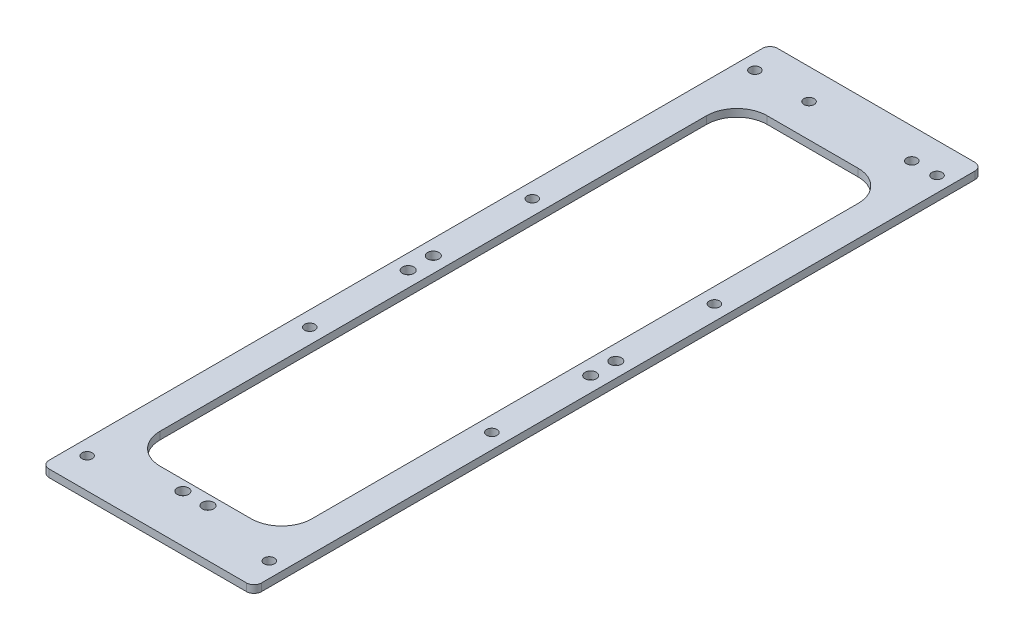
ISO-10303-21;
HEADER;
FILE_DESCRIPTION(('STEP AP214'),'2;1');
FILE_NAME('part.step','',(''),(''),'','','');
FILE_SCHEMA(('AUTOMOTIVE_DESIGN { 1 0 10303 214 1 1 1 1 }'));
ENDSEC;
DATA;
#1=APPLICATION_CONTEXT('core data for automotive mechanical design processes');
#2=APPLICATION_PROTOCOL_DEFINITION('international standard','automotive_design',2000,#1);
#3=PRODUCT_CONTEXT('',#1,'mechanical');
#4=PRODUCT('Part','Part','',(#3));
#5=PRODUCT_RELATED_PRODUCT_CATEGORY('part','',(#4));
#6=PRODUCT_DEFINITION_FORMATION('','',#4);
#7=PRODUCT_DEFINITION_CONTEXT('part definition',#1,'design');
#8=PRODUCT_DEFINITION('design','',#6,#7);
#9=PRODUCT_DEFINITION_SHAPE('','',#8);
#10=(LENGTH_UNIT() NAMED_UNIT(*) SI_UNIT(.MILLI.,.METRE.));
#11=(NAMED_UNIT(*) PLANE_ANGLE_UNIT() SI_UNIT($,.RADIAN.));
#12=(NAMED_UNIT(*) SI_UNIT($,.STERADIAN.) SOLID_ANGLE_UNIT());
#13=UNCERTAINTY_MEASURE_WITH_UNIT(LENGTH_MEASURE(1.E-05),#10,'distance_accuracy_value','');
#14=(GEOMETRIC_REPRESENTATION_CONTEXT(3) GLOBAL_UNCERTAINTY_ASSIGNED_CONTEXT((#13)) GLOBAL_UNIT_ASSIGNED_CONTEXT((#10,
#11,#12)) REPRESENTATION_CONTEXT('',''));
#15=CARTESIAN_POINT('',(0.,0.,0.));
#16=DIRECTION('',(0.,0.,1.));
#17=DIRECTION('',(1.,0.,0.));
#18=AXIS2_PLACEMENT_3D('',#15,#16,#17);
#19=CARTESIAN_POINT('',(0.,3.175,0.));
#20=DIRECTION('',(0.,1.,0.));
#21=DIRECTION('',(0.,0.,1.));
#22=AXIS2_PLACEMENT_3D('',#19,#20,#21);
#23=PLANE('',#22);
#24=CARTESIAN_POINT('',(38.1811171147674,3.175,-5.24625));
#25=DIRECTION('',(0.,1.,0.));
#26=DIRECTION('',(0.,0.,-1.));
#27=AXIS2_PLACEMENT_3D('',#24,#25,#26);
#28=CIRCLE('',#27,2.38125);
#29=CARTESIAN_POINT('',(38.1811171147674,3.175,-7.62749999999999));
#30=VERTEX_POINT('',#29);
#31=EDGE_CURVE('E360',#30,#30,#28,.T.);
#32=ORIENTED_EDGE('',*,*,#31,.F.);
#33=EDGE_LOOP('',(#32));
#34=FACE_BOUND('',#33,.T.);
#35=CARTESIAN_POINT('',(38.1811171147674,3.175,5.24625));
#36=DIRECTION('',(0.,1.,0.));
#37=DIRECTION('',(0.,0.,1.));
#38=AXIS2_PLACEMENT_3D('',#35,#36,#37);
#39=CIRCLE('',#38,2.38125);
#40=CARTESIAN_POINT('',(38.1811171147674,3.175,7.6275));
#41=VERTEX_POINT('',#40);
#42=EDGE_CURVE('E366',#41,#41,#39,.T.);
#43=ORIENTED_EDGE('',*,*,#42,.F.);
#44=EDGE_LOOP('',(#43));
#45=FACE_BOUND('',#44,.T.);
#46=CARTESIAN_POINT('',(-38.1811171147674,3.175,5.24625));
#47=DIRECTION('',(0.,1.,0.));
#48=DIRECTION('',(0.,0.,-1.));
#49=AXIS2_PLACEMENT_3D('',#46,#47,#48);
#50=CIRCLE('',#49,2.38125);
#51=CARTESIAN_POINT('',(-38.1811171147674,3.175,2.86500000000001));
#52=VERTEX_POINT('',#51);
#53=EDGE_CURVE('E372',#52,#52,#50,.T.);
#54=ORIENTED_EDGE('',*,*,#53,.F.);
#55=EDGE_LOOP('',(#54));
#56=FACE_BOUND('',#55,.T.);
#57=CARTESIAN_POINT('',(-38.1811171147674,3.175,-5.24625));
#58=DIRECTION('',(0.,1.,0.));
#59=DIRECTION('',(0.,0.,1.));
#60=AXIS2_PLACEMENT_3D('',#57,#58,#59);
#61=CIRCLE('',#60,2.38125);
#62=CARTESIAN_POINT('',(-38.1811171147674,3.175,-2.865));
#63=VERTEX_POINT('',#62);
#64=EDGE_CURVE('E354',#63,#63,#61,.T.);
#65=ORIENTED_EDGE('',*,*,#64,.F.);
#66=EDGE_LOOP('',(#65));
#67=FACE_BOUND('',#66,.T.);
#68=CARTESIAN_POINT('',(-5.24624998499998,3.175,132.45823257716));
#69=DIRECTION('',(0.,1.,0.));
#70=DIRECTION('',(0.,0.,1.));
#71=AXIS2_PLACEMENT_3D('',#68,#69,#70);
#72=CIRCLE('',#71,2.38125);
#73=CARTESIAN_POINT('',(-5.24624998499998,3.175,134.83948257716));
#74=VERTEX_POINT('',#73);
#75=EDGE_CURVE('E349',#74,#74,#72,.T.);
#76=ORIENTED_EDGE('',*,*,#75,.F.);
#77=EDGE_LOOP('',(#76));
#78=FACE_BOUND('',#77,.T.);
#79=CARTESIAN_POINT('',(5.24624998500002,3.175,132.45823257716));
#80=DIRECTION('',(0.,1.,0.));
#81=DIRECTION('',(0.,0.,-1.));
#82=AXIS2_PLACEMENT_3D('',#79,#80,#81);
#83=CIRCLE('',#82,2.38125);
#84=CARTESIAN_POINT('',(5.24624998500002,3.175,130.07698257716));
#85=VERTEX_POINT('',#84);
#86=EDGE_CURVE('E342',#85,#85,#83,.T.);
#87=ORIENTED_EDGE('',*,*,#86,.F.);
#88=EDGE_LOOP('',(#87));
#89=FACE_BOUND('',#88,.T.);
#90=CARTESIAN_POINT('',(-15.4178,3.175,-139.7));
#91=DIRECTION('',(0.,1.,0.));
#92=DIRECTION('',(0.,0.,1.));
#93=AXIS2_PLACEMENT_3D('',#90,#91,#92);
#94=CIRCLE('',#93,2.15899999999999);
#95=CARTESIAN_POINT('',(-15.4178,3.175,-137.541));
#96=VERTEX_POINT('',#95);
#97=EDGE_CURVE('E337',#96,#96,#94,.T.);
#98=ORIENTED_EDGE('',*,*,#97,.F.);
#99=EDGE_LOOP('',(#98));
#100=FACE_BOUND('',#99,.T.);
#101=CARTESIAN_POINT('',(27.5844,3.175,-139.7));
#102=DIRECTION('',(0.,1.,0.));
#103=DIRECTION('',(0.,0.,1.));
#104=AXIS2_PLACEMENT_3D('',#101,#102,#103);
#105=CIRCLE('',#104,2.15899999999999);
#106=CARTESIAN_POINT('',(27.5844,3.175,-137.541));
#107=VERTEX_POINT('',#106);
#108=EDGE_CURVE('E333',#107,#107,#105,.T.);
#109=ORIENTED_EDGE('',*,*,#108,.F.);
#110=EDGE_LOOP('',(#109));
#111=FACE_BOUND('',#110,.T.);
#112=CARTESIAN_POINT('',(38.1,3.175,-46.6021183814132));
#113=DIRECTION('',(0.,1.,0.));
#114=DIRECTION('',(0.,0.,-1.));
#115=AXIS2_PLACEMENT_3D('',#112,#113,#114);
#116=CIRCLE('',#115,2.15899999999998);
#117=CARTESIAN_POINT('',(38.1,3.175,-48.7611183814132));
#118=VERTEX_POINT('',#117);
#119=EDGE_CURVE('E300',#118,#118,#116,.T.);
#120=ORIENTED_EDGE('',*,*,#119,.F.);
#121=EDGE_LOOP('',(#120));
#122=FACE_BOUND('',#121,.T.);
#123=CARTESIAN_POINT('',(-38.1,3.175,139.663955618587));
#124=DIRECTION('',(0.,1.,0.));
#125=DIRECTION('',(0.,0.,1.));
#126=AXIS2_PLACEMENT_3D('',#123,#124,#125);
#127=CIRCLE('',#126,2.15899999999998);
#128=CARTESIAN_POINT('',(-38.1,3.175,141.822955618587));
#129=VERTEX_POINT('',#128);
#130=EDGE_CURVE('E307',#129,#129,#127,.T.);
#131=ORIENTED_EDGE('',*,*,#130,.F.);
#132=EDGE_LOOP('',(#131));
#133=FACE_BOUND('',#132,.T.);
#134=CARTESIAN_POINT('',(-38.1,3.175,46.5305376185868));
#135=DIRECTION('',(0.,1.,0.));
#136=DIRECTION('',(0.,0.,1.));
#137=AXIS2_PLACEMENT_3D('',#134,#135,#136);
#138=CIRCLE('',#137,2.15899999999998);
#139=CARTESIAN_POINT('',(-38.1,3.175,48.6895376185868));
#140=VERTEX_POINT('',#139);
#141=EDGE_CURVE('E288',#140,#140,#138,.T.);
#142=ORIENTED_EDGE('',*,*,#141,.F.);
#143=EDGE_LOOP('',(#142));
#144=FACE_BOUND('',#143,.T.);
#145=CARTESIAN_POINT('',(-38.1,3.175,-46.6028803814132));
#146=DIRECTION('',(0.,1.,0.));
#147=DIRECTION('',(0.,0.,1.));
#148=AXIS2_PLACEMENT_3D('',#145,#146,#147);
#149=CIRCLE('',#148,2.15899999999998);
#150=CARTESIAN_POINT('',(-38.1,3.175,-44.4438803814132));
#151=VERTEX_POINT('',#150);
#152=EDGE_CURVE('E295',#151,#151,#149,.T.);
#153=ORIENTED_EDGE('',*,*,#152,.F.);
#154=EDGE_LOOP('',(#153));
#155=FACE_BOUND('',#154,.T.);
#156=CARTESIAN_POINT('',(38.1,3.175,46.5320616185868));
#157=DIRECTION('',(0.,1.,0.));
#158=DIRECTION('',(0.,0.,-1.));
#159=AXIS2_PLACEMENT_3D('',#156,#157,#158);
#160=CIRCLE('',#159,2.15899999999998);
#161=CARTESIAN_POINT('',(38.1,3.175,44.3730616185868));
#162=VERTEX_POINT('',#161);
#163=EDGE_CURVE('E325',#162,#162,#160,.T.);
#164=ORIENTED_EDGE('',*,*,#163,.F.);
#165=EDGE_LOOP('',(#164));
#166=FACE_BOUND('',#165,.T.);
#167=CARTESIAN_POINT('',(38.1,3.175,139.666241618587));
#168=DIRECTION('',(0.,1.,0.));
#169=DIRECTION('',(0.,0.,-1.));
#170=AXIS2_PLACEMENT_3D('',#167,#168,#169);
#171=CIRCLE('',#170,2.15899999999998);
#172=CARTESIAN_POINT('',(38.1,3.175,137.507241618587));
#173=VERTEX_POINT('',#172);
#174=EDGE_CURVE('E319',#173,#173,#171,.T.);
#175=ORIENTED_EDGE('',*,*,#174,.F.);
#176=EDGE_LOOP('',(#175));
#177=FACE_BOUND('',#176,.T.);
#178=CARTESIAN_POINT('',(38.1,3.175,-139.736298381413));
#179=DIRECTION('',(0.,1.,0.));
#180=DIRECTION('',(0.,0.,-1.));
#181=AXIS2_PLACEMENT_3D('',#178,#179,#180);
#182=CIRCLE('',#181,2.15899999999998);
#183=CARTESIAN_POINT('',(38.1,3.175,-141.895298381413));
#184=VERTEX_POINT('',#183);
#185=EDGE_CURVE('E312',#184,#184,#182,.T.);
#186=ORIENTED_EDGE('',*,*,#185,.F.);
#187=EDGE_LOOP('',(#186));
#188=FACE_BOUND('',#187,.T.);
#189=CARTESIAN_POINT('',(-38.1,3.175,-139.736298381413));
#190=DIRECTION('',(0.,1.,0.));
#191=DIRECTION('',(0.,0.,1.));
#192=AXIS2_PLACEMENT_3D('',#189,#190,#191);
#193=CIRCLE('',#192,2.15899999999998);
#194=CARTESIAN_POINT('',(-38.1,3.175,-137.577298381413));
#195=VERTEX_POINT('',#194);
#196=EDGE_CURVE('E282',#195,#195,#193,.T.);
#197=ORIENTED_EDGE('',*,*,#196,.F.);
#198=EDGE_LOOP('',(#197));
#199=FACE_BOUND('',#198,.T.);
#200=DIRECTION('',(0.,0.,1.));
#201=VECTOR('',#200,1.);
#202=CARTESIAN_POINT('',(-44.45,3.175,-152.4));
#203=LINE('',#202,#201);
#204=CARTESIAN_POINT('',(-44.45,3.175,-149.225));
#205=VERTEX_POINT('',#204);
#206=CARTESIAN_POINT('',(-44.45,3.175,149.225));
#207=VERTEX_POINT('',#206);
#208=EDGE_CURVE('E253',#205,#207,#203,.T.);
#209=ORIENTED_EDGE('',*,*,#208,.T.);
#210=CARTESIAN_POINT('',(-41.275,3.175,149.225));
#211=DIRECTION('',(0.,1.,0.));
#212=DIRECTION('',(0.,0.,1.));
#213=AXIS2_PLACEMENT_3D('',#210,#211,#212);
#214=CIRCLE('',#213,3.175);
#215=CARTESIAN_POINT('',(-41.275,3.175,152.4));
#216=VERTEX_POINT('',#215);
#217=EDGE_CURVE('E232',#207,#216,#214,.T.);
#218=ORIENTED_EDGE('',*,*,#217,.T.);
#219=DIRECTION('',(1.,0.,0.));
#220=VECTOR('',#219,1.);
#221=CARTESIAN_POINT('',(-44.45,3.175,152.4));
#222=LINE('',#221,#220);
#223=CARTESIAN_POINT('',(41.275,3.175,152.4));
#224=VERTEX_POINT('',#223);
#225=EDGE_CURVE('E261',#216,#224,#222,.T.);
#226=ORIENTED_EDGE('',*,*,#225,.T.);
#227=CARTESIAN_POINT('',(41.275,3.175,149.225));
#228=DIRECTION('',(0.,1.,0.));
#229=DIRECTION('',(0.,0.,1.));
#230=AXIS2_PLACEMENT_3D('',#227,#228,#229);
#231=CIRCLE('',#230,3.175);
#232=CARTESIAN_POINT('',(44.45,3.175,149.225));
#233=VERTEX_POINT('',#232);
#234=EDGE_CURVE('E230',#224,#233,#231,.T.);
#235=ORIENTED_EDGE('',*,*,#234,.T.);
#236=DIRECTION('',(0.,0.,-1.));
#237=VECTOR('',#236,1.);
#238=CARTESIAN_POINT('',(44.45,3.175,-152.4));
#239=LINE('',#238,#237);
#240=CARTESIAN_POINT('',(44.45,3.175,-149.225));
#241=VERTEX_POINT('',#240);
#242=EDGE_CURVE('E178',#233,#241,#239,.T.);
#243=ORIENTED_EDGE('',*,*,#242,.T.);
#244=CARTESIAN_POINT('',(41.275,3.175,-149.225));
#245=DIRECTION('',(0.,1.,0.));
#246=DIRECTION('',(0.,0.,1.));
#247=AXIS2_PLACEMENT_3D('',#244,#245,#246);
#248=CIRCLE('',#247,3.175);
#249=CARTESIAN_POINT('',(41.275,3.175,-152.4));
#250=VERTEX_POINT('',#249);
#251=EDGE_CURVE('E55',#241,#250,#248,.T.);
#252=ORIENTED_EDGE('',*,*,#251,.T.);
#253=DIRECTION('',(-1.,0.,0.));
#254=VECTOR('',#253,1.);
#255=CARTESIAN_POINT('',(-44.45,3.175,-152.4));
#256=LINE('',#255,#254);
#257=CARTESIAN_POINT('',(-41.275,3.175,-152.4));
#258=VERTEX_POINT('',#257);
#259=EDGE_CURVE('E174',#250,#258,#256,.T.);
#260=ORIENTED_EDGE('',*,*,#259,.T.);
#261=CARTESIAN_POINT('',(-41.275,3.175,-149.225));
#262=DIRECTION('',(0.,1.,0.));
#263=DIRECTION('',(0.,0.,1.));
#264=AXIS2_PLACEMENT_3D('',#261,#262,#263);
#265=CIRCLE('',#264,3.175);
#266=EDGE_CURVE('E227',#258,#205,#265,.T.);
#267=ORIENTED_EDGE('',*,*,#266,.T.);
#268=EDGE_LOOP('',(#209,#218,#226,#235,#243,#252,#260,#267));
#269=FACE_BOUND('',#268,.T.);
#270=DIRECTION('',(1.,0.,0.));
#271=VECTOR('',#270,1.);
#272=CARTESIAN_POINT('',(-31.75,3.175,128.17693257716));
#273=LINE('',#272,#271);
#274=CARTESIAN_POINT('',(-19.05,3.175,128.17693257716));
#275=VERTEX_POINT('',#274);
#276=CARTESIAN_POINT('',(19.05,3.175,128.17693257716));
#277=VERTEX_POINT('',#276);
#278=EDGE_CURVE('E278',#275,#277,#273,.T.);
#279=ORIENTED_EDGE('',*,*,#278,.F.);
#280=CARTESIAN_POINT('',(-19.05,3.175,115.47693257716));
#281=DIRECTION('',(0.,1.,0.));
#282=DIRECTION('',(0.,0.,1.));
#283=AXIS2_PLACEMENT_3D('',#280,#281,#282);
#284=CIRCLE('',#283,12.7);
#285=CARTESIAN_POINT('',(-31.75,3.175,115.47693257716));
#286=VERTEX_POINT('',#285);
#287=EDGE_CURVE('E159',#275,#286,#284,.F.);
#288=ORIENTED_EDGE('',*,*,#287,.T.);
#289=DIRECTION('',(0.,0.,1.));
#290=VECTOR('',#289,1.);
#291=CARTESIAN_POINT('',(-31.75,3.175,-125.82306742284));
#292=LINE('',#291,#290);
#293=CARTESIAN_POINT('',(-31.75,3.175,-113.12306742284));
#294=VERTEX_POINT('',#293);
#295=EDGE_CURVE('E268',#294,#286,#292,.T.);
#296=ORIENTED_EDGE('',*,*,#295,.F.);
#297=CARTESIAN_POINT('',(-19.05,3.175,-113.12306742284));
#298=DIRECTION('',(0.,1.,0.));
#299=DIRECTION('',(0.,0.,1.));
#300=AXIS2_PLACEMENT_3D('',#297,#298,#299);
#301=CIRCLE('',#300,12.7);
#302=CARTESIAN_POINT('',(-19.05,3.175,-125.82306742284));
#303=VERTEX_POINT('',#302);
#304=EDGE_CURVE('E203',#294,#303,#301,.F.);
#305=ORIENTED_EDGE('',*,*,#304,.T.);
#306=DIRECTION('',(-1.,0.,0.));
#307=VECTOR('',#306,1.);
#308=CARTESIAN_POINT('',(-31.75,3.175,-125.82306742284));
#309=LINE('',#308,#307);
#310=CARTESIAN_POINT('',(19.05,3.175,-125.82306742284));
#311=VERTEX_POINT('',#310);
#312=EDGE_CURVE('E258',#311,#303,#309,.T.);
#313=ORIENTED_EDGE('',*,*,#312,.F.);
#314=CARTESIAN_POINT('',(19.0500000000001,3.175,-113.12306742284));
#315=DIRECTION('',(0.,1.,0.));
#316=DIRECTION('',(0.,0.,1.));
#317=AXIS2_PLACEMENT_3D('',#314,#315,#316);
#318=CIRCLE('',#317,12.7);
#319=CARTESIAN_POINT('',(31.75,3.175,-113.12306742284));
#320=VERTEX_POINT('',#319);
#321=EDGE_CURVE('E207',#311,#320,#318,.F.);
#322=ORIENTED_EDGE('',*,*,#321,.T.);
#323=DIRECTION('',(0.,0.,-1.));
#324=VECTOR('',#323,1.);
#325=CARTESIAN_POINT('',(31.75,3.175,-125.82306742284));
#326=LINE('',#325,#324);
#327=CARTESIAN_POINT('',(31.75,3.175,115.47693257716));
#328=VERTEX_POINT('',#327);
#329=EDGE_CURVE('E275',#328,#320,#326,.T.);
#330=ORIENTED_EDGE('',*,*,#329,.F.);
#331=CARTESIAN_POINT('',(19.05,3.175,115.47693257716));
#332=DIRECTION('',(0.,1.,0.));
#333=DIRECTION('',(0.,0.,1.));
#334=AXIS2_PLACEMENT_3D('',#331,#332,#333);
#335=CIRCLE('',#334,12.7);
#336=EDGE_CURVE('E160',#328,#277,#335,.F.);
#337=ORIENTED_EDGE('',*,*,#336,.T.);
#338=EDGE_LOOP('',(#279,#288,#296,#305,#313,#322,#330,#337));
#339=FACE_BOUND('',#338,.T.);
#340=ADVANCED_FACE('F34',(#34,#45,#56,#67,#78,#89,#100,#111,#122,#133,#144,#155,#166,#177,#188,
#199,#269,#339),#23,.T.);
#341=CARTESIAN_POINT('',(0.,0.,0.));
#342=DIRECTION('',(0.,1.,0.));
#343=DIRECTION('',(0.,0.,1.));
#344=AXIS2_PLACEMENT_3D('',#341,#342,#343);
#345=PLANE('',#344);
#346=CARTESIAN_POINT('',(38.1811171147674,0.,-5.24625));
#347=DIRECTION('',(0.,1.,0.));
#348=DIRECTION('',(0.,0.,-1.));
#349=AXIS2_PLACEMENT_3D('',#346,#347,#348);
#350=CIRCLE('',#349,2.38125);
#351=CARTESIAN_POINT('',(38.1811171147674,0.,-7.62749999999999));
#352=VERTEX_POINT('',#351);
#353=EDGE_CURVE('E363',#352,#352,#350,.T.);
#354=ORIENTED_EDGE('',*,*,#353,.T.);
#355=EDGE_LOOP('',(#354));
#356=FACE_BOUND('',#355,.T.);
#357=CARTESIAN_POINT('',(38.1811171147674,0.,5.24625));
#358=DIRECTION('',(0.,1.,0.));
#359=DIRECTION('',(0.,0.,1.));
#360=AXIS2_PLACEMENT_3D('',#357,#358,#359);
#361=CIRCLE('',#360,2.38125);
#362=CARTESIAN_POINT('',(38.1811171147674,0.,7.6275));
#363=VERTEX_POINT('',#362);
#364=EDGE_CURVE('E369',#363,#363,#361,.T.);
#365=ORIENTED_EDGE('',*,*,#364,.T.);
#366=EDGE_LOOP('',(#365));
#367=FACE_BOUND('',#366,.T.);
#368=CARTESIAN_POINT('',(-38.1811171147674,0.,5.24625));
#369=DIRECTION('',(0.,1.,0.));
#370=DIRECTION('',(0.,0.,-1.));
#371=AXIS2_PLACEMENT_3D('',#368,#369,#370);
#372=CIRCLE('',#371,2.38125);
#373=CARTESIAN_POINT('',(-38.1811171147674,0.,2.86500000000001));
#374=VERTEX_POINT('',#373);
#375=EDGE_CURVE('E357',#374,#374,#372,.T.);
#376=ORIENTED_EDGE('',*,*,#375,.T.);
#377=EDGE_LOOP('',(#376));
#378=FACE_BOUND('',#377,.T.);
#379=CARTESIAN_POINT('',(-38.1811171147674,0.,-5.24625));
#380=DIRECTION('',(0.,1.,0.));
#381=DIRECTION('',(0.,0.,1.));
#382=AXIS2_PLACEMENT_3D('',#379,#380,#381);
#383=CIRCLE('',#382,2.38125);
#384=CARTESIAN_POINT('',(-38.1811171147674,0.,-2.865));
#385=VERTEX_POINT('',#384);
#386=EDGE_CURVE('E346',#385,#385,#383,.T.);
#387=ORIENTED_EDGE('',*,*,#386,.T.);
#388=EDGE_LOOP('',(#387));
#389=FACE_BOUND('',#388,.T.);
#390=CARTESIAN_POINT('',(-5.24624998499998,0.,132.45823257716));
#391=DIRECTION('',(0.,1.,0.));
#392=DIRECTION('',(0.,0.,1.));
#393=AXIS2_PLACEMENT_3D('',#390,#391,#392);
#394=CIRCLE('',#393,2.38125);
#395=CARTESIAN_POINT('',(-5.24624998499998,0.,134.83948257716));
#396=VERTEX_POINT('',#395);
#397=EDGE_CURVE('E334',#396,#396,#394,.T.);
#398=ORIENTED_EDGE('',*,*,#397,.T.);
#399=EDGE_LOOP('',(#398));
#400=FACE_BOUND('',#399,.T.);
#401=CARTESIAN_POINT('',(5.24624998500002,0.,132.45823257716));
#402=DIRECTION('',(0.,1.,0.));
#403=DIRECTION('',(0.,0.,-1.));
#404=AXIS2_PLACEMENT_3D('',#401,#402,#403);
#405=CIRCLE('',#404,2.38125);
#406=CARTESIAN_POINT('',(5.24624998500002,0.,130.07698257716));
#407=VERTEX_POINT('',#406);
#408=EDGE_CURVE('E345',#407,#407,#405,.T.);
#409=ORIENTED_EDGE('',*,*,#408,.T.);
#410=EDGE_LOOP('',(#409));
#411=FACE_BOUND('',#410,.T.);
#412=CARTESIAN_POINT('',(-15.4178,0.,-139.7));
#413=DIRECTION('',(0.,1.,0.));
#414=DIRECTION('',(0.,0.,1.));
#415=AXIS2_PLACEMENT_3D('',#412,#413,#414);
#416=CIRCLE('',#415,2.15899999999999);
#417=CARTESIAN_POINT('',(-15.4178,0.,-137.541));
#418=VERTEX_POINT('',#417);
#419=EDGE_CURVE('E316',#418,#418,#416,.T.);
#420=ORIENTED_EDGE('',*,*,#419,.T.);
#421=EDGE_LOOP('',(#420));
#422=FACE_BOUND('',#421,.T.);
#423=CARTESIAN_POINT('',(27.5844,0.,-139.7));
#424=DIRECTION('',(0.,1.,0.));
#425=DIRECTION('',(0.,0.,1.));
#426=AXIS2_PLACEMENT_3D('',#423,#424,#425);
#427=CIRCLE('',#426,2.15899999999999);
#428=CARTESIAN_POINT('',(27.5844,0.,-137.541));
#429=VERTEX_POINT('',#428);
#430=EDGE_CURVE('E330',#429,#429,#427,.T.);
#431=ORIENTED_EDGE('',*,*,#430,.T.);
#432=EDGE_LOOP('',(#431));
#433=FACE_BOUND('',#432,.T.);
#434=CARTESIAN_POINT('',(38.1,0.,-46.6021183814132));
#435=DIRECTION('',(0.,1.,0.));
#436=DIRECTION('',(0.,0.,-1.));
#437=AXIS2_PLACEMENT_3D('',#434,#435,#436);
#438=CIRCLE('',#437,2.15899999999998);
#439=CARTESIAN_POINT('',(38.1,0.,-48.7611183814132));
#440=VERTEX_POINT('',#439);
#441=EDGE_CURVE('E303',#440,#440,#438,.T.);
#442=ORIENTED_EDGE('',*,*,#441,.T.);
#443=EDGE_LOOP('',(#442));
#444=FACE_BOUND('',#443,.T.);
#445=CARTESIAN_POINT('',(-38.1,0.,139.663955618587));
#446=DIRECTION('',(0.,1.,0.));
#447=DIRECTION('',(0.,0.,1.));
#448=AXIS2_PLACEMENT_3D('',#445,#446,#447);
#449=CIRCLE('',#448,2.15899999999998);
#450=CARTESIAN_POINT('',(-38.1,0.,141.822955618587));
#451=VERTEX_POINT('',#450);
#452=EDGE_CURVE('E292',#451,#451,#449,.T.);
#453=ORIENTED_EDGE('',*,*,#452,.T.);
#454=EDGE_LOOP('',(#453));
#455=FACE_BOUND('',#454,.T.);
#456=CARTESIAN_POINT('',(-38.1,0.,46.5305376185868));
#457=DIRECTION('',(0.,1.,0.));
#458=DIRECTION('',(0.,0.,1.));
#459=AXIS2_PLACEMENT_3D('',#456,#457,#458);
#460=CIRCLE('',#459,2.15899999999998);
#461=CARTESIAN_POINT('',(-38.1,0.,48.6895376185868));
#462=VERTEX_POINT('',#461);
#463=EDGE_CURVE('E291',#462,#462,#460,.T.);
#464=ORIENTED_EDGE('',*,*,#463,.T.);
#465=EDGE_LOOP('',(#464));
#466=FACE_BOUND('',#465,.T.);
#467=CARTESIAN_POINT('',(-38.1,0.,-46.6028803814132));
#468=DIRECTION('',(0.,1.,0.));
#469=DIRECTION('',(0.,0.,1.));
#470=AXIS2_PLACEMENT_3D('',#467,#468,#469);
#471=CIRCLE('',#470,2.15899999999998);
#472=CARTESIAN_POINT('',(-38.1,0.,-44.4438803814132));
#473=VERTEX_POINT('',#472);
#474=EDGE_CURVE('E285',#473,#473,#471,.T.);
#475=ORIENTED_EDGE('',*,*,#474,.T.);
#476=EDGE_LOOP('',(#475));
#477=FACE_BOUND('',#476,.T.);
#478=CARTESIAN_POINT('',(38.1,0.,46.5320616185868));
#479=DIRECTION('',(0.,1.,0.));
#480=DIRECTION('',(0.,0.,-1.));
#481=AXIS2_PLACEMENT_3D('',#478,#479,#480);
#482=CIRCLE('',#481,2.15899999999998);
#483=CARTESIAN_POINT('',(38.1,0.,44.3730616185868));
#484=VERTEX_POINT('',#483);
#485=EDGE_CURVE('E304',#484,#484,#482,.T.);
#486=ORIENTED_EDGE('',*,*,#485,.T.);
#487=EDGE_LOOP('',(#486));
#488=FACE_BOUND('',#487,.T.);
#489=CARTESIAN_POINT('',(38.1,0.,139.666241618587));
#490=DIRECTION('',(0.,1.,0.));
#491=DIRECTION('',(0.,0.,-1.));
#492=AXIS2_PLACEMENT_3D('',#489,#490,#491);
#493=CIRCLE('',#492,2.15899999999998);
#494=CARTESIAN_POINT('',(38.1,0.,137.507241618587));
#495=VERTEX_POINT('',#494);
#496=EDGE_CURVE('E322',#495,#495,#493,.T.);
#497=ORIENTED_EDGE('',*,*,#496,.T.);
#498=EDGE_LOOP('',(#497));
#499=FACE_BOUND('',#498,.T.);
#500=CARTESIAN_POINT('',(38.1,0.,-139.736298381413));
#501=DIRECTION('',(0.,1.,0.));
#502=DIRECTION('',(0.,0.,-1.));
#503=AXIS2_PLACEMENT_3D('',#500,#501,#502);
#504=CIRCLE('',#503,2.15899999999998);
#505=CARTESIAN_POINT('',(38.1,0.,-141.895298381413));
#506=VERTEX_POINT('',#505);
#507=EDGE_CURVE('E315',#506,#506,#504,.T.);
#508=ORIENTED_EDGE('',*,*,#507,.T.);
#509=EDGE_LOOP('',(#508));
#510=FACE_BOUND('',#509,.T.);
#511=CARTESIAN_POINT('',(-38.1,0.,-139.736298381413));
#512=DIRECTION('',(0.,1.,0.));
#513=DIRECTION('',(0.,0.,1.));
#514=AXIS2_PLACEMENT_3D('',#511,#512,#513);
#515=CIRCLE('',#514,2.15899999999998);
#516=CARTESIAN_POINT('',(-38.1,0.,-137.577298381413));
#517=VERTEX_POINT('',#516);
#518=EDGE_CURVE('E272',#517,#517,#515,.T.);
#519=ORIENTED_EDGE('',*,*,#518,.T.);
#520=EDGE_LOOP('',(#519));
#521=FACE_BOUND('',#520,.T.);
#522=DIRECTION('',(1.,0.,0.));
#523=VECTOR('',#522,1.);
#524=CARTESIAN_POINT('',(-44.45,0.,152.4));
#525=LINE('',#524,#523);
#526=CARTESIAN_POINT('',(-41.275,0.,152.4));
#527=VERTEX_POINT('',#526);
#528=CARTESIAN_POINT('',(41.275,0.,152.4));
#529=VERTEX_POINT('',#528);
#530=EDGE_CURVE('E252',#527,#529,#525,.T.);
#531=ORIENTED_EDGE('',*,*,#530,.F.);
#532=CARTESIAN_POINT('',(-41.275,0.,149.225));
#533=DIRECTION('',(0.,1.,0.));
#534=DIRECTION('',(0.,0.,1.));
#535=AXIS2_PLACEMENT_3D('',#532,#533,#534);
#536=CIRCLE('',#535,3.175);
#537=CARTESIAN_POINT('',(-44.45,0.,149.225));
#538=VERTEX_POINT('',#537);
#539=EDGE_CURVE('E220',#527,#538,#536,.F.);
#540=ORIENTED_EDGE('',*,*,#539,.T.);
#541=DIRECTION('',(0.,0.,1.));
#542=VECTOR('',#541,1.);
#543=CARTESIAN_POINT('',(-44.45,0.,-152.4));
#544=LINE('',#543,#542);
#545=CARTESIAN_POINT('',(-44.45,0.,-149.225));
#546=VERTEX_POINT('',#545);
#547=EDGE_CURVE('E254',#546,#538,#544,.T.);
#548=ORIENTED_EDGE('',*,*,#547,.F.);
#549=CARTESIAN_POINT('',(-41.275,0.,-149.225));
#550=DIRECTION('',(0.,1.,0.));
#551=DIRECTION('',(0.,0.,1.));
#552=AXIS2_PLACEMENT_3D('',#549,#550,#551);
#553=CIRCLE('',#552,3.175);
#554=CARTESIAN_POINT('',(-41.275,0.,-152.4));
#555=VERTEX_POINT('',#554);
#556=EDGE_CURVE('E214',#546,#555,#553,.F.);
#557=ORIENTED_EDGE('',*,*,#556,.T.);
#558=DIRECTION('',(-1.,0.,0.));
#559=VECTOR('',#558,1.);
#560=CARTESIAN_POINT('',(-44.45,0.,-152.4));
#561=LINE('',#560,#559);
#562=CARTESIAN_POINT('',(41.275,0.,-152.4));
#563=VERTEX_POINT('',#562);
#564=EDGE_CURVE('E181',#563,#555,#561,.T.);
#565=ORIENTED_EDGE('',*,*,#564,.F.);
#566=CARTESIAN_POINT('',(41.275,0.,-149.225));
#567=DIRECTION('',(0.,1.,0.));
#568=DIRECTION('',(0.,0.,1.));
#569=AXIS2_PLACEMENT_3D('',#566,#567,#568);
#570=CIRCLE('',#569,3.175);
#571=CARTESIAN_POINT('',(44.45,0.,-149.225));
#572=VERTEX_POINT('',#571);
#573=EDGE_CURVE('E216',#563,#572,#570,.F.);
#574=ORIENTED_EDGE('',*,*,#573,.T.);
#575=DIRECTION('',(0.,0.,-1.));
#576=VECTOR('',#575,1.);
#577=CARTESIAN_POINT('',(44.45,0.,-152.4));
#578=LINE('',#577,#576);
#579=CARTESIAN_POINT('',(44.45,0.,149.225));
#580=VERTEX_POINT('',#579);
#581=EDGE_CURVE('E244',#580,#572,#578,.T.);
#582=ORIENTED_EDGE('',*,*,#581,.F.);
#583=CARTESIAN_POINT('',(41.275,0.,149.225));
#584=DIRECTION('',(0.,1.,0.));
#585=DIRECTION('',(0.,0.,1.));
#586=AXIS2_PLACEMENT_3D('',#583,#584,#585);
#587=CIRCLE('',#586,3.175);
#588=EDGE_CURVE('E218',#580,#529,#587,.F.);
#589=ORIENTED_EDGE('',*,*,#588,.T.);
#590=EDGE_LOOP('',(#531,#540,#548,#557,#565,#574,#582,#589));
#591=FACE_BOUND('',#590,.T.);
#592=DIRECTION('',(-1.,0.,0.));
#593=VECTOR('',#592,1.);
#594=CARTESIAN_POINT('',(-31.75,0.,-125.82306742284));
#595=LINE('',#594,#593);
#596=CARTESIAN_POINT('',(19.05,0.,-125.82306742284));
#597=VERTEX_POINT('',#596);
#598=CARTESIAN_POINT('',(-19.05,0.,-125.82306742284));
#599=VERTEX_POINT('',#598);
#600=EDGE_CURVE('E266',#597,#599,#595,.T.);
#601=ORIENTED_EDGE('',*,*,#600,.T.);
#602=CARTESIAN_POINT('',(-19.05,0.,-113.12306742284));
#603=DIRECTION('',(0.,1.,0.));
#604=DIRECTION('',(0.,0.,1.));
#605=AXIS2_PLACEMENT_3D('',#602,#603,#604);
#606=CIRCLE('',#605,12.7);
#607=CARTESIAN_POINT('',(-31.75,0.,-113.12306742284));
#608=VERTEX_POINT('',#607);
#609=EDGE_CURVE('E201',#599,#608,#606,.T.);
#610=ORIENTED_EDGE('',*,*,#609,.T.);
#611=DIRECTION('',(0.,0.,1.));
#612=VECTOR('',#611,1.);
#613=CARTESIAN_POINT('',(-31.75,0.,-125.82306742284));
#614=LINE('',#613,#612);
#615=CARTESIAN_POINT('',(-31.75,0.,115.47693257716));
#616=VERTEX_POINT('',#615);
#617=EDGE_CURVE('E154',#608,#616,#614,.T.);
#618=ORIENTED_EDGE('',*,*,#617,.T.);
#619=CARTESIAN_POINT('',(-19.05,0.,115.47693257716));
#620=DIRECTION('',(0.,1.,0.));
#621=DIRECTION('',(0.,0.,1.));
#622=AXIS2_PLACEMENT_3D('',#619,#620,#621);
#623=CIRCLE('',#622,12.7);
#624=CARTESIAN_POINT('',(-19.05,0.,128.17693257716));
#625=VERTEX_POINT('',#624);
#626=EDGE_CURVE('E148',#616,#625,#623,.T.);
#627=ORIENTED_EDGE('',*,*,#626,.T.);
#628=DIRECTION('',(1.,0.,0.));
#629=VECTOR('',#628,1.);
#630=CARTESIAN_POINT('',(-31.75,0.,128.17693257716));
#631=LINE('',#630,#629);
#632=CARTESIAN_POINT('',(19.05,0.,128.17693257716));
#633=VERTEX_POINT('',#632);
#634=EDGE_CURVE('E152',#625,#633,#631,.T.);
#635=ORIENTED_EDGE('',*,*,#634,.T.);
#636=CARTESIAN_POINT('',(19.05,0.,115.47693257716));
#637=DIRECTION('',(0.,1.,0.));
#638=DIRECTION('',(0.,0.,1.));
#639=AXIS2_PLACEMENT_3D('',#636,#637,#638);
#640=CIRCLE('',#639,12.7);
#641=CARTESIAN_POINT('',(31.75,0.,115.47693257716));
#642=VERTEX_POINT('',#641);
#643=EDGE_CURVE('E197',#633,#642,#640,.T.);
#644=ORIENTED_EDGE('',*,*,#643,.T.);
#645=DIRECTION('',(0.,0.,-1.));
#646=VECTOR('',#645,1.);
#647=CARTESIAN_POINT('',(31.75,0.,-125.82306742284));
#648=LINE('',#647,#646);
#649=CARTESIAN_POINT('',(31.75,0.,-113.12306742284));
#650=VERTEX_POINT('',#649);
#651=EDGE_CURVE('E170',#642,#650,#648,.T.);
#652=ORIENTED_EDGE('',*,*,#651,.T.);
#653=CARTESIAN_POINT('',(19.0500000000001,0.,-113.12306742284));
#654=DIRECTION('',(0.,1.,0.));
#655=DIRECTION('',(0.,0.,1.));
#656=AXIS2_PLACEMENT_3D('',#653,#654,#655);
#657=CIRCLE('',#656,12.7);
#658=EDGE_CURVE('E205',#650,#597,#657,.T.);
#659=ORIENTED_EDGE('',*,*,#658,.T.);
#660=EDGE_LOOP('',(#601,#610,#618,#627,#635,#644,#652,#659));
#661=FACE_BOUND('',#660,.T.);
#662=ADVANCED_FACE('F151',(#356,#367,#378,#389,#400,#411,#422,#433,#444,#455,#466,#477,#488,
#499,#510,#521,#591,#661),#345,.F.);
#663=CARTESIAN_POINT('',(-44.45,3.175,-152.4));
#664=DIRECTION('',(1.,0.,0.));
#665=DIRECTION('',(0.,0.,-1.));
#666=AXIS2_PLACEMENT_3D('',#663,#664,#665);
#667=PLANE('',#666);
#668=ORIENTED_EDGE('',*,*,#547,.T.);
#669=DIRECTION('',(0.,-1.,0.));
#670=VECTOR('',#669,1.);
#671=CARTESIAN_POINT('',(-44.45,3.175,149.225));
#672=LINE('',#671,#670);
#673=EDGE_CURVE('E225',#538,#207,#672,.F.);
#674=ORIENTED_EDGE('',*,*,#673,.T.);
#675=ORIENTED_EDGE('',*,*,#208,.F.);
#676=DIRECTION('',(0.,-1.,0.));
#677=VECTOR('',#676,1.);
#678=CARTESIAN_POINT('',(-44.45,3.175,-149.225));
#679=LINE('',#678,#677);
#680=EDGE_CURVE('E222',#205,#546,#679,.T.);
#681=ORIENTED_EDGE('',*,*,#680,.T.);
#682=EDGE_LOOP('',(#668,#674,#675,#681));
#683=FACE_BOUND('',#682,.T.);
#684=ADVANCED_FACE('F457',(#683),#667,.F.);
#685=CARTESIAN_POINT('',(-44.45,3.175,152.4));
#686=DIRECTION('',(0.,0.,-1.));
#687=DIRECTION('',(-1.,0.,0.));
#688=AXIS2_PLACEMENT_3D('',#685,#686,#687);
#689=PLANE('',#688);
#690=ORIENTED_EDGE('',*,*,#225,.F.);
#691=DIRECTION('',(0.,-1.,0.));
#692=VECTOR('',#691,1.);
#693=CARTESIAN_POINT('',(-41.275,3.175,152.4));
#694=LINE('',#693,#692);
#695=EDGE_CURVE('E211',#216,#527,#694,.T.);
#696=ORIENTED_EDGE('',*,*,#695,.T.);
#697=ORIENTED_EDGE('',*,*,#530,.T.);
#698=DIRECTION('',(0.,-1.,0.));
#699=VECTOR('',#698,1.);
#700=CARTESIAN_POINT('',(41.275,3.175,152.4));
#701=LINE('',#700,#699);
#702=EDGE_CURVE('E209',#529,#224,#701,.F.);
#703=ORIENTED_EDGE('',*,*,#702,.T.);
#704=EDGE_LOOP('',(#690,#696,#697,#703));
#705=FACE_BOUND('',#704,.T.);
#706=ADVANCED_FACE('F462',(#705),#689,.F.);
#707=CARTESIAN_POINT('',(44.45,3.175,-152.4));
#708=DIRECTION('',(-1.,0.,0.));
#709=DIRECTION('',(0.,0.,1.));
#710=AXIS2_PLACEMENT_3D('',#707,#708,#709);
#711=PLANE('',#710);
#712=ORIENTED_EDGE('',*,*,#242,.F.);
#713=DIRECTION('',(0.,-1.,0.));
#714=VECTOR('',#713,1.);
#715=CARTESIAN_POINT('',(44.45,3.175,149.225));
#716=LINE('',#715,#714);
#717=EDGE_CURVE('E236',#233,#580,#716,.T.);
#718=ORIENTED_EDGE('',*,*,#717,.T.);
#719=ORIENTED_EDGE('',*,*,#581,.T.);
#720=DIRECTION('',(0.,-1.,0.));
#721=VECTOR('',#720,1.);
#722=CARTESIAN_POINT('',(44.45,3.175,-149.225));
#723=LINE('',#722,#721);
#724=EDGE_CURVE('E234',#572,#241,#723,.F.);
#725=ORIENTED_EDGE('',*,*,#724,.T.);
#726=EDGE_LOOP('',(#712,#718,#719,#725));
#727=FACE_BOUND('',#726,.T.);
#728=ADVANCED_FACE('F243',(#727),#711,.F.);
#729=CARTESIAN_POINT('',(-44.45,3.175,-152.4));
#730=DIRECTION('',(0.,0.,1.));
#731=DIRECTION('',(1.,0.,0.));
#732=AXIS2_PLACEMENT_3D('',#729,#730,#731);
#733=PLANE('',#732);
#734=ORIENTED_EDGE('',*,*,#259,.F.);
#735=DIRECTION('',(0.,-1.,0.));
#736=VECTOR('',#735,1.);
#737=CARTESIAN_POINT('',(41.275,3.175,-152.4));
#738=LINE('',#737,#736);
#739=EDGE_CURVE('E11',#250,#563,#738,.T.);
#740=ORIENTED_EDGE('',*,*,#739,.T.);
#741=ORIENTED_EDGE('',*,*,#564,.T.);
#742=DIRECTION('',(0.,-1.,0.));
#743=VECTOR('',#742,1.);
#744=CARTESIAN_POINT('',(-41.275,3.175,-152.4));
#745=LINE('',#744,#743);
#746=EDGE_CURVE('E42',#555,#258,#745,.F.);
#747=ORIENTED_EDGE('',*,*,#746,.T.);
#748=EDGE_LOOP('',(#734,#740,#741,#747));
#749=FACE_BOUND('',#748,.T.);
#750=ADVANCED_FACE('F446',(#749),#733,.F.);
#751=CARTESIAN_POINT('',(-31.75,3.175,-125.82306742284));
#752=DIRECTION('',(1.,0.,0.));
#753=DIRECTION('',(0.,0.,-1.));
#754=AXIS2_PLACEMENT_3D('',#751,#752,#753);
#755=PLANE('',#754);
#756=ORIENTED_EDGE('',*,*,#295,.T.);
#757=DIRECTION('',(0.,-1.,0.));
#758=VECTOR('',#757,1.);
#759=CARTESIAN_POINT('',(-31.75,0.,115.47693257716));
#760=LINE('',#759,#758);
#761=EDGE_CURVE('E190',#286,#616,#760,.T.);
#762=ORIENTED_EDGE('',*,*,#761,.T.);
#763=ORIENTED_EDGE('',*,*,#617,.F.);
#764=DIRECTION('',(0.,-1.,0.));
#765=VECTOR('',#764,1.);
#766=CARTESIAN_POINT('',(-31.75,3.175,-113.12306742284));
#767=LINE('',#766,#765);
#768=EDGE_CURVE('E188',#608,#294,#767,.F.);
#769=ORIENTED_EDGE('',*,*,#768,.T.);
#770=EDGE_LOOP('',(#756,#762,#763,#769));
#771=FACE_BOUND('',#770,.T.);
#772=ADVANCED_FACE('F444',(#771),#755,.T.);
#773=CARTESIAN_POINT('',(-31.75,3.175,128.17693257716));
#774=DIRECTION('',(0.,0.,-1.));
#775=DIRECTION('',(-1.,0.,0.));
#776=AXIS2_PLACEMENT_3D('',#773,#774,#775);
#777=PLANE('',#776);
#778=ORIENTED_EDGE('',*,*,#278,.T.);
#779=DIRECTION('',(0.,-1.,0.));
#780=VECTOR('',#779,1.);
#781=CARTESIAN_POINT('',(19.05,0.,128.17693257716));
#782=LINE('',#781,#780);
#783=EDGE_CURVE('E169',#277,#633,#782,.T.);
#784=ORIENTED_EDGE('',*,*,#783,.T.);
#785=ORIENTED_EDGE('',*,*,#634,.F.);
#786=DIRECTION('',(0.,-1.,0.));
#787=VECTOR('',#786,1.);
#788=CARTESIAN_POINT('',(-19.05,3.175,128.17693257716));
#789=LINE('',#788,#787);
#790=EDGE_CURVE('E166',#625,#275,#789,.F.);
#791=ORIENTED_EDGE('',*,*,#790,.T.);
#792=EDGE_LOOP('',(#778,#784,#785,#791));
#793=FACE_BOUND('',#792,.T.);
#794=ADVANCED_FACE('F165',(#793),#777,.T.);
#795=CARTESIAN_POINT('',(31.75,3.175,-125.82306742284));
#796=DIRECTION('',(-1.,0.,0.));
#797=DIRECTION('',(0.,0.,1.));
#798=AXIS2_PLACEMENT_3D('',#795,#796,#797);
#799=PLANE('',#798);
#800=ORIENTED_EDGE('',*,*,#651,.F.);
#801=DIRECTION('',(0.,-1.,0.));
#802=VECTOR('',#801,1.);
#803=CARTESIAN_POINT('',(31.75,3.175,115.47693257716));
#804=LINE('',#803,#802);
#805=EDGE_CURVE('E186',#642,#328,#804,.F.);
#806=ORIENTED_EDGE('',*,*,#805,.T.);
#807=ORIENTED_EDGE('',*,*,#329,.T.);
#808=DIRECTION('',(0.,-1.,0.));
#809=VECTOR('',#808,1.);
#810=CARTESIAN_POINT('',(31.75,0.,-113.12306742284));
#811=LINE('',#810,#809);
#812=EDGE_CURVE('E176',#320,#650,#811,.T.);
#813=ORIENTED_EDGE('',*,*,#812,.T.);
#814=EDGE_LOOP('',(#800,#806,#807,#813));
#815=FACE_BOUND('',#814,.T.);
#816=ADVANCED_FACE('F428',(#815),#799,.T.);
#817=CARTESIAN_POINT('',(-31.75,3.175,-125.82306742284));
#818=DIRECTION('',(0.,0.,1.));
#819=DIRECTION('',(1.,0.,0.));
#820=AXIS2_PLACEMENT_3D('',#817,#818,#819);
#821=PLANE('',#820);
#822=ORIENTED_EDGE('',*,*,#312,.T.);
#823=DIRECTION('',(0.,-1.,0.));
#824=VECTOR('',#823,1.);
#825=CARTESIAN_POINT('',(-19.05,0.,-125.82306742284));
#826=LINE('',#825,#824);
#827=EDGE_CURVE('E194',#303,#599,#826,.T.);
#828=ORIENTED_EDGE('',*,*,#827,.T.);
#829=ORIENTED_EDGE('',*,*,#600,.F.);
#830=DIRECTION('',(0.,-1.,0.));
#831=VECTOR('',#830,1.);
#832=CARTESIAN_POINT('',(19.0500000000001,3.175,-125.82306742284));
#833=LINE('',#832,#831);
#834=EDGE_CURVE('E192',#597,#311,#833,.F.);
#835=ORIENTED_EDGE('',*,*,#834,.T.);
#836=EDGE_LOOP('',(#822,#828,#829,#835));
#837=FACE_BOUND('',#836,.T.);
#838=ADVANCED_FACE('F436',(#837),#821,.T.);
#839=CARTESIAN_POINT('',(-38.1,0.,-139.736298381413));
#840=DIRECTION('',(0.,1.,0.));
#841=DIRECTION('',(0.,0.,1.));
#842=AXIS2_PLACEMENT_3D('',#839,#840,#841);
#843=CYLINDRICAL_SURFACE('',#842,2.15899999999998);
#844=ORIENTED_EDGE('',*,*,#518,.F.);
#845=EDGE_LOOP('',(#844));
#846=FACE_BOUND('',#845,.T.);
#847=ORIENTED_EDGE('',*,*,#196,.T.);
#848=EDGE_LOOP('',(#847));
#849=FACE_BOUND('',#848,.T.);
#850=ADVANCED_FACE('F528',(#846,#849),#843,.F.);
#851=CARTESIAN_POINT('',(38.1,0.,-139.736298381413));
#852=DIRECTION('',(0.,1.,0.));
#853=DIRECTION('',(0.,0.,1.));
#854=AXIS2_PLACEMENT_3D('',#851,#852,#853);
#855=CYLINDRICAL_SURFACE('',#854,2.15899999999998);
#856=ORIENTED_EDGE('',*,*,#507,.F.);
#857=EDGE_LOOP('',(#856));
#858=FACE_BOUND('',#857,.T.);
#859=ORIENTED_EDGE('',*,*,#185,.T.);
#860=EDGE_LOOP('',(#859));
#861=FACE_BOUND('',#860,.T.);
#862=ADVANCED_FACE('F524',(#858,#861),#855,.F.);
#863=CARTESIAN_POINT('',(38.1,0.,139.666241618587));
#864=DIRECTION('',(0.,1.,0.));
#865=DIRECTION('',(0.,0.,1.));
#866=AXIS2_PLACEMENT_3D('',#863,#864,#865);
#867=CYLINDRICAL_SURFACE('',#866,2.15899999999998);
#868=ORIENTED_EDGE('',*,*,#496,.F.);
#869=EDGE_LOOP('',(#868));
#870=FACE_BOUND('',#869,.T.);
#871=ORIENTED_EDGE('',*,*,#174,.T.);
#872=EDGE_LOOP('',(#871));
#873=FACE_BOUND('',#872,.T.);
#874=ADVANCED_FACE('F520',(#870,#873),#867,.F.);
#875=CARTESIAN_POINT('',(38.1,0.,46.5320616185868));
#876=DIRECTION('',(0.,1.,0.));
#877=DIRECTION('',(0.,0.,1.));
#878=AXIS2_PLACEMENT_3D('',#875,#876,#877);
#879=CYLINDRICAL_SURFACE('',#878,2.15899999999998);
#880=ORIENTED_EDGE('',*,*,#485,.F.);
#881=EDGE_LOOP('',(#880));
#882=FACE_BOUND('',#881,.T.);
#883=ORIENTED_EDGE('',*,*,#163,.T.);
#884=EDGE_LOOP('',(#883));
#885=FACE_BOUND('',#884,.T.);
#886=ADVANCED_FACE('F516',(#882,#885),#879,.F.);
#887=CARTESIAN_POINT('',(-38.1,0.,-46.6028803814132));
#888=DIRECTION('',(0.,1.,0.));
#889=DIRECTION('',(0.,0.,1.));
#890=AXIS2_PLACEMENT_3D('',#887,#888,#889);
#891=CYLINDRICAL_SURFACE('',#890,2.15899999999998);
#892=ORIENTED_EDGE('',*,*,#474,.F.);
#893=EDGE_LOOP('',(#892));
#894=FACE_BOUND('',#893,.T.);
#895=ORIENTED_EDGE('',*,*,#152,.T.);
#896=EDGE_LOOP('',(#895));
#897=FACE_BOUND('',#896,.T.);
#898=ADVANCED_FACE('F519',(#894,#897),#891,.F.);
#899=CARTESIAN_POINT('',(-38.1,0.,46.5305376185868));
#900=DIRECTION('',(0.,1.,0.));
#901=DIRECTION('',(0.,0.,1.));
#902=AXIS2_PLACEMENT_3D('',#899,#900,#901);
#903=CYLINDRICAL_SURFACE('',#902,2.15899999999998);
#904=ORIENTED_EDGE('',*,*,#463,.F.);
#905=EDGE_LOOP('',(#904));
#906=FACE_BOUND('',#905,.T.);
#907=ORIENTED_EDGE('',*,*,#141,.T.);
#908=EDGE_LOOP('',(#907));
#909=FACE_BOUND('',#908,.T.);
#910=ADVANCED_FACE('F533',(#906,#909),#903,.F.);
#911=CARTESIAN_POINT('',(-38.1,0.,139.663955618587));
#912=DIRECTION('',(0.,1.,0.));
#913=DIRECTION('',(0.,0.,1.));
#914=AXIS2_PLACEMENT_3D('',#911,#912,#913);
#915=CYLINDRICAL_SURFACE('',#914,2.15899999999998);
#916=ORIENTED_EDGE('',*,*,#452,.F.);
#917=EDGE_LOOP('',(#916));
#918=FACE_BOUND('',#917,.T.);
#919=ORIENTED_EDGE('',*,*,#130,.T.);
#920=EDGE_LOOP('',(#919));
#921=FACE_BOUND('',#920,.T.);
#922=ADVANCED_FACE('F530',(#918,#921),#915,.F.);
#923=CARTESIAN_POINT('',(38.1,0.,-46.6021183814132));
#924=DIRECTION('',(0.,1.,0.));
#925=DIRECTION('',(0.,0.,1.));
#926=AXIS2_PLACEMENT_3D('',#923,#924,#925);
#927=CYLINDRICAL_SURFACE('',#926,2.15899999999998);
#928=ORIENTED_EDGE('',*,*,#441,.F.);
#929=EDGE_LOOP('',(#928));
#930=FACE_BOUND('',#929,.T.);
#931=ORIENTED_EDGE('',*,*,#119,.T.);
#932=EDGE_LOOP('',(#931));
#933=FACE_BOUND('',#932,.T.);
#934=ADVANCED_FACE('F471',(#930,#933),#927,.F.);
#935=CARTESIAN_POINT('',(19.05,3.175,115.47693257716));
#936=DIRECTION('',(0.,1.,0.));
#937=DIRECTION('',(0.,0.,1.));
#938=AXIS2_PLACEMENT_3D('',#935,#936,#937);
#939=CYLINDRICAL_SURFACE('',#938,12.7);
#940=ORIENTED_EDGE('',*,*,#336,.F.);
#941=ORIENTED_EDGE('',*,*,#805,.F.);
#942=ORIENTED_EDGE('',*,*,#643,.F.);
#943=ORIENTED_EDGE('',*,*,#783,.F.);
#944=EDGE_LOOP('',(#940,#941,#942,#943));
#945=FACE_BOUND('',#944,.T.);
#946=ADVANCED_FACE('F424',(#945),#939,.F.);
#947=CARTESIAN_POINT('',(-19.05,3.175,115.47693257716));
#948=DIRECTION('',(0.,1.,0.));
#949=DIRECTION('',(0.,0.,1.));
#950=AXIS2_PLACEMENT_3D('',#947,#948,#949);
#951=CYLINDRICAL_SURFACE('',#950,12.7);
#952=ORIENTED_EDGE('',*,*,#287,.F.);
#953=ORIENTED_EDGE('',*,*,#790,.F.);
#954=ORIENTED_EDGE('',*,*,#626,.F.);
#955=ORIENTED_EDGE('',*,*,#761,.F.);
#956=EDGE_LOOP('',(#952,#953,#954,#955));
#957=FACE_BOUND('',#956,.T.);
#958=ADVANCED_FACE('F173',(#957),#951,.F.);
#959=CARTESIAN_POINT('',(-19.05,3.175,-113.12306742284));
#960=DIRECTION('',(0.,1.,0.));
#961=DIRECTION('',(0.,0.,1.));
#962=AXIS2_PLACEMENT_3D('',#959,#960,#961);
#963=CYLINDRICAL_SURFACE('',#962,12.7);
#964=ORIENTED_EDGE('',*,*,#304,.F.);
#965=ORIENTED_EDGE('',*,*,#768,.F.);
#966=ORIENTED_EDGE('',*,*,#609,.F.);
#967=ORIENTED_EDGE('',*,*,#827,.F.);
#968=EDGE_LOOP('',(#964,#965,#966,#967));
#969=FACE_BOUND('',#968,.T.);
#970=ADVANCED_FACE('F441',(#969),#963,.F.);
#971=CARTESIAN_POINT('',(19.0500000000001,3.175,-113.12306742284));
#972=DIRECTION('',(0.,1.,0.));
#973=DIRECTION('',(0.,0.,1.));
#974=AXIS2_PLACEMENT_3D('',#971,#972,#973);
#975=CYLINDRICAL_SURFACE('',#974,12.7);
#976=ORIENTED_EDGE('',*,*,#321,.F.);
#977=ORIENTED_EDGE('',*,*,#834,.F.);
#978=ORIENTED_EDGE('',*,*,#658,.F.);
#979=ORIENTED_EDGE('',*,*,#812,.F.);
#980=EDGE_LOOP('',(#976,#977,#978,#979));
#981=FACE_BOUND('',#980,.T.);
#982=ADVANCED_FACE('F432',(#981),#975,.F.);
#983=CARTESIAN_POINT('',(-41.275,3.175,149.225));
#984=DIRECTION('',(0.,-1.,0.));
#985=DIRECTION('',(0.,0.,-1.));
#986=AXIS2_PLACEMENT_3D('',#983,#984,#985);
#987=CYLINDRICAL_SURFACE('',#986,3.175);
#988=ORIENTED_EDGE('',*,*,#217,.F.);
#989=ORIENTED_EDGE('',*,*,#673,.F.);
#990=ORIENTED_EDGE('',*,*,#539,.F.);
#991=ORIENTED_EDGE('',*,*,#695,.F.);
#992=EDGE_LOOP('',(#988,#989,#990,#991));
#993=FACE_BOUND('',#992,.T.);
#994=ADVANCED_FACE('F478',(#993),#987,.T.);
#995=CARTESIAN_POINT('',(41.275,3.175,149.225));
#996=DIRECTION('',(0.,-1.,0.));
#997=DIRECTION('',(0.,0.,-1.));
#998=AXIS2_PLACEMENT_3D('',#995,#996,#997);
#999=CYLINDRICAL_SURFACE('',#998,3.175);
#1000=ORIENTED_EDGE('',*,*,#234,.F.);
#1001=ORIENTED_EDGE('',*,*,#702,.F.);
#1002=ORIENTED_EDGE('',*,*,#588,.F.);
#1003=ORIENTED_EDGE('',*,*,#717,.F.);
#1004=EDGE_LOOP('',(#1000,#1001,#1002,#1003));
#1005=FACE_BOUND('',#1004,.T.);
#1006=ADVANCED_FACE('F481',(#1005),#999,.T.);
#1007=CARTESIAN_POINT('',(41.275,3.175,-149.225));
#1008=DIRECTION('',(0.,-1.,0.));
#1009=DIRECTION('',(0.,0.,-1.));
#1010=AXIS2_PLACEMENT_3D('',#1007,#1008,#1009);
#1011=CYLINDRICAL_SURFACE('',#1010,3.175);
#1012=ORIENTED_EDGE('',*,*,#251,.F.);
#1013=ORIENTED_EDGE('',*,*,#724,.F.);
#1014=ORIENTED_EDGE('',*,*,#573,.F.);
#1015=ORIENTED_EDGE('',*,*,#739,.F.);
#1016=EDGE_LOOP('',(#1012,#1013,#1014,#1015));
#1017=FACE_BOUND('',#1016,.T.);
#1018=ADVANCED_FACE('F484',(#1017),#1011,.T.);
#1019=CARTESIAN_POINT('',(-41.275,3.175,-149.225));
#1020=DIRECTION('',(0.,-1.,0.));
#1021=DIRECTION('',(0.,0.,-1.));
#1022=AXIS2_PLACEMENT_3D('',#1019,#1020,#1021);
#1023=CYLINDRICAL_SURFACE('',#1022,3.175);
#1024=ORIENTED_EDGE('',*,*,#266,.F.);
#1025=ORIENTED_EDGE('',*,*,#746,.F.);
#1026=ORIENTED_EDGE('',*,*,#556,.F.);
#1027=ORIENTED_EDGE('',*,*,#680,.F.);
#1028=EDGE_LOOP('',(#1024,#1025,#1026,#1027));
#1029=FACE_BOUND('',#1028,.T.);
#1030=ADVANCED_FACE('F36',(#1029),#1023,.T.);
#1031=CARTESIAN_POINT('',(27.5844,0.,-139.7));
#1032=DIRECTION('',(0.,1.,0.));
#1033=DIRECTION('',(0.,0.,1.));
#1034=AXIS2_PLACEMENT_3D('',#1031,#1032,#1033);
#1035=CYLINDRICAL_SURFACE('',#1034,2.15899999999999);
#1036=ORIENTED_EDGE('',*,*,#430,.F.);
#1037=EDGE_LOOP('',(#1036));
#1038=FACE_BOUND('',#1037,.T.);
#1039=ORIENTED_EDGE('',*,*,#108,.T.);
#1040=EDGE_LOOP('',(#1039));
#1041=FACE_BOUND('',#1040,.T.);
#1042=ADVANCED_FACE('F490',(#1038,#1041),#1035,.F.);
#1043=CARTESIAN_POINT('',(-15.4178,0.,-139.7));
#1044=DIRECTION('',(0.,1.,0.));
#1045=DIRECTION('',(0.,0.,1.));
#1046=AXIS2_PLACEMENT_3D('',#1043,#1044,#1045);
#1047=CYLINDRICAL_SURFACE('',#1046,2.15899999999999);
#1048=ORIENTED_EDGE('',*,*,#419,.F.);
#1049=EDGE_LOOP('',(#1048));
#1050=FACE_BOUND('',#1049,.T.);
#1051=ORIENTED_EDGE('',*,*,#97,.T.);
#1052=EDGE_LOOP('',(#1051));
#1053=FACE_BOUND('',#1052,.T.);
#1054=ADVANCED_FACE('F503',(#1050,#1053),#1047,.F.);
#1055=CARTESIAN_POINT('',(5.24624998500002,0.,132.45823257716));
#1056=DIRECTION('',(0.,1.,0.));
#1057=DIRECTION('',(0.,0.,1.));
#1058=AXIS2_PLACEMENT_3D('',#1055,#1056,#1057);
#1059=CYLINDRICAL_SURFACE('',#1058,2.38125);
#1060=ORIENTED_EDGE('',*,*,#408,.F.);
#1061=EDGE_LOOP('',(#1060));
#1062=FACE_BOUND('',#1061,.T.);
#1063=ORIENTED_EDGE('',*,*,#86,.T.);
#1064=EDGE_LOOP('',(#1063));
#1065=FACE_BOUND('',#1064,.T.);
#1066=ADVANCED_FACE('F509',(#1062,#1065),#1059,.F.);
#1067=CARTESIAN_POINT('',(-5.24624998499998,0.,132.45823257716));
#1068=DIRECTION('',(0.,1.,0.));
#1069=DIRECTION('',(0.,0.,1.));
#1070=AXIS2_PLACEMENT_3D('',#1067,#1068,#1069);
#1071=CYLINDRICAL_SURFACE('',#1070,2.38125);
#1072=ORIENTED_EDGE('',*,*,#397,.F.);
#1073=EDGE_LOOP('',(#1072));
#1074=FACE_BOUND('',#1073,.T.);
#1075=ORIENTED_EDGE('',*,*,#75,.T.);
#1076=EDGE_LOOP('',(#1075));
#1077=FACE_BOUND('',#1076,.T.);
#1078=ADVANCED_FACE('F642',(#1074,#1077),#1071,.F.);
#1079=CARTESIAN_POINT('',(-38.1811171147674,0.,-5.24625));
#1080=DIRECTION('',(0.,1.,0.));
#1081=DIRECTION('',(0.,0.,1.));
#1082=AXIS2_PLACEMENT_3D('',#1079,#1080,#1081);
#1083=CYLINDRICAL_SURFACE('',#1082,2.38125);
#1084=ORIENTED_EDGE('',*,*,#386,.F.);
#1085=EDGE_LOOP('',(#1084));
#1086=FACE_BOUND('',#1085,.T.);
#1087=ORIENTED_EDGE('',*,*,#64,.T.);
#1088=EDGE_LOOP('',(#1087));
#1089=FACE_BOUND('',#1088,.T.);
#1090=ADVANCED_FACE('F384',(#1086,#1089),#1083,.F.);
#1091=CARTESIAN_POINT('',(-38.1811171147674,0.,5.24625));
#1092=DIRECTION('',(0.,1.,0.));
#1093=DIRECTION('',(0.,0.,1.));
#1094=AXIS2_PLACEMENT_3D('',#1091,#1092,#1093);
#1095=CYLINDRICAL_SURFACE('',#1094,2.38125);
#1096=ORIENTED_EDGE('',*,*,#375,.F.);
#1097=EDGE_LOOP('',(#1096));
#1098=FACE_BOUND('',#1097,.T.);
#1099=ORIENTED_EDGE('',*,*,#53,.T.);
#1100=EDGE_LOOP('',(#1099));
#1101=FACE_BOUND('',#1100,.T.);
#1102=ADVANCED_FACE('F380',(#1098,#1101),#1095,.F.);
#1103=CARTESIAN_POINT('',(38.1811171147674,0.,5.24625));
#1104=DIRECTION('',(0.,1.,0.));
#1105=DIRECTION('',(0.,0.,1.));
#1106=AXIS2_PLACEMENT_3D('',#1103,#1104,#1105);
#1107=CYLINDRICAL_SURFACE('',#1106,2.38125);
#1108=ORIENTED_EDGE('',*,*,#364,.F.);
#1109=EDGE_LOOP('',(#1108));
#1110=FACE_BOUND('',#1109,.T.);
#1111=ORIENTED_EDGE('',*,*,#42,.T.);
#1112=EDGE_LOOP('',(#1111));
#1113=FACE_BOUND('',#1112,.T.);
#1114=ADVANCED_FACE('F383',(#1110,#1113),#1107,.F.);
#1115=CARTESIAN_POINT('',(38.1811171147674,0.,-5.24625));
#1116=DIRECTION('',(0.,1.,0.));
#1117=DIRECTION('',(0.,0.,1.));
#1118=AXIS2_PLACEMENT_3D('',#1115,#1116,#1117);
#1119=CYLINDRICAL_SURFACE('',#1118,2.38125);
#1120=ORIENTED_EDGE('',*,*,#353,.F.);
#1121=EDGE_LOOP('',(#1120));
#1122=FACE_BOUND('',#1121,.T.);
#1123=ORIENTED_EDGE('',*,*,#31,.T.);
#1124=EDGE_LOOP('',(#1123));
#1125=FACE_BOUND('',#1124,.T.);
#1126=ADVANCED_FACE('F683',(#1122,#1125),#1119,.F.);
#1127=CLOSED_SHELL('',(#340,#662,#684,#706,#728,#750,#772,#794,#816,#838,#850,#862,#874,#886,
#898,#910,#922,#934,#946,#958,#970,#982,#994,#1006,#1018,#1030,#1042,#1054,#1066,#1078,#1090,
#1102,#1114,#1126));
#1128=MANIFOLD_SOLID_BREP('B2',#1127);
#1129=ADVANCED_BREP_SHAPE_REPRESENTATION('',(#18,#1128),#14);
#1130=SHAPE_DEFINITION_REPRESENTATION(#9,#1129);
ENDSEC;
END-ISO-10303-21;
